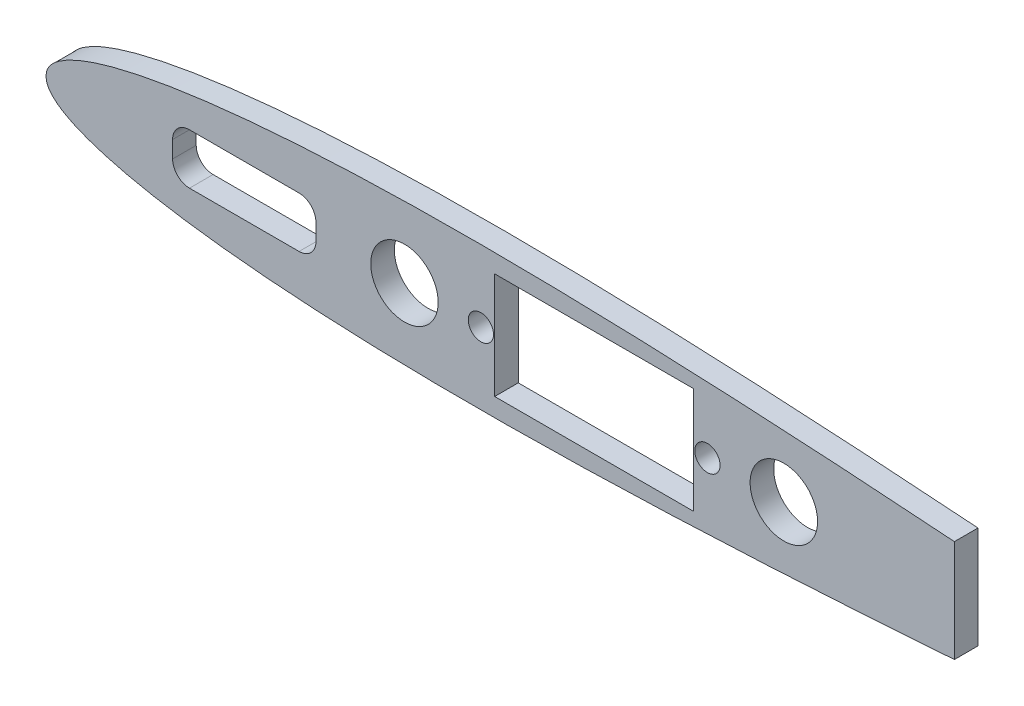
ISO-10303-21;
HEADER;
FILE_DESCRIPTION(('STEP AP214'),'2;1');
FILE_NAME('part.step','',(''),(''),'','','');
FILE_SCHEMA(('AUTOMOTIVE_DESIGN { 1 0 10303 214 1 1 1 1 }'));
ENDSEC;
DATA;
#1=APPLICATION_CONTEXT('core data for automotive mechanical design processes');
#2=APPLICATION_PROTOCOL_DEFINITION('international standard','automotive_design',2000,#1);
#3=PRODUCT_CONTEXT('',#1,'mechanical');
#4=PRODUCT('Part','Part','',(#3));
#5=PRODUCT_RELATED_PRODUCT_CATEGORY('part','',(#4));
#6=PRODUCT_DEFINITION_FORMATION('','',#4);
#7=PRODUCT_DEFINITION_CONTEXT('part definition',#1,'design');
#8=PRODUCT_DEFINITION('design','',#6,#7);
#9=PRODUCT_DEFINITION_SHAPE('','',#8);
#10=(LENGTH_UNIT() NAMED_UNIT(*) SI_UNIT(.MILLI.,.METRE.));
#11=(NAMED_UNIT(*) PLANE_ANGLE_UNIT() SI_UNIT($,.RADIAN.));
#12=(NAMED_UNIT(*) SI_UNIT($,.STERADIAN.) SOLID_ANGLE_UNIT());
#13=UNCERTAINTY_MEASURE_WITH_UNIT(LENGTH_MEASURE(1.E-05),#10,'distance_accuracy_value','');
#14=(GEOMETRIC_REPRESENTATION_CONTEXT(3) GLOBAL_UNCERTAINTY_ASSIGNED_CONTEXT((#13)) GLOBAL_UNIT_ASSIGNED_CONTEXT((#10,
#11,#12)) REPRESENTATION_CONTEXT('',''));
#15=CARTESIAN_POINT('',(0.,0.,0.));
#16=DIRECTION('',(0.,0.,1.));
#17=DIRECTION('',(1.,0.,0.));
#18=AXIS2_PLACEMENT_3D('',#15,#16,#17);
#19=CARTESIAN_POINT('',(217.74763411893,0.,1.4));
#20=DIRECTION('',(1.,0.,0.));
#21=DIRECTION('',(0.,0.,-1.));
#22=AXIS2_PLACEMENT_3D('',#19,#20,#21);
#23=PLANE('',#22);
#24=DIRECTION('',(0.,-1.,0.));
#25=VECTOR('',#24,1.);
#26=CARTESIAN_POINT('',(217.74763411893,0.,-1.4));
#27=LINE('',#26,#25);
#28=CARTESIAN_POINT('',(217.74763411893,6.05811307778919,-1.4));
#29=VERTEX_POINT('',#28);
#30=CARTESIAN_POINT('',(217.74763411893,-6.05811307778918,-1.4));
#31=VERTEX_POINT('',#30);
#32=EDGE_CURVE('E154',#29,#31,#27,.T.);
#33=ORIENTED_EDGE('',*,*,#32,.F.);
#34=DIRECTION('',(0.,0.,-1.));
#35=VECTOR('',#34,1.);
#36=CARTESIAN_POINT('',(217.74763411893,6.05811307778919,1.4));
#37=LINE('',#36,#35);
#38=CARTESIAN_POINT('',(217.74763411893,6.05811307778919,1.4));
#39=VERTEX_POINT('',#38);
#40=EDGE_CURVE('E11',#39,#29,#37,.T.);
#41=ORIENTED_EDGE('',*,*,#40,.F.);
#42=DIRECTION('',(0.,-1.,0.));
#43=VECTOR('',#42,1.);
#44=CARTESIAN_POINT('',(217.74763411893,0.,1.4));
#45=LINE('',#44,#43);
#46=CARTESIAN_POINT('',(217.74763411893,-6.05811307778918,1.4));
#47=VERTEX_POINT('',#46);
#48=EDGE_CURVE('E153',#39,#47,#45,.T.);
#49=ORIENTED_EDGE('',*,*,#48,.T.);
#50=DIRECTION('',(0.,0.,-1.));
#51=VECTOR('',#50,1.);
#52=CARTESIAN_POINT('',(217.74763411893,-6.05811307778918,1.4));
#53=LINE('',#52,#51);
#54=EDGE_CURVE('E111',#47,#31,#53,.T.);
#55=ORIENTED_EDGE('',*,*,#54,.T.);
#56=EDGE_LOOP('',(#33,#41,#49,#55));
#57=FACE_BOUND('',#56,.T.);
#58=ADVANCED_FACE('F36',(#57),#23,.T.);
#59=CARTESIAN_POINT('',(280.,0.1785,1.4));
#60=CARTESIAN_POINT('',(279.592043703671,0.226075897783467,1.4));
#61=CARTESIAN_POINT('',(278.452596210234,0.358958360844463,1.4));
#62=CARTESIAN_POINT('',(276.385426802208,0.596436481937331,1.4));
#63=CARTESIAN_POINT('',(273.651166983567,0.905304265461348,1.4));
#64=CARTESIAN_POINT('',(270.455833183168,1.25859090467058,1.4));
#65=CARTESIAN_POINT('',(266.898988861825,1.64260730411104,1.4));
#66=CARTESIAN_POINT('',(263.047743378214,2.04785660385741,1.4));
#67=CARTESIAN_POINT('',(258.952644661846,2.46718813772148,1.4));
#68=CARTESIAN_POINT('',(253.11611192075,3.04786904369115,1.4));
#69=CARTESIAN_POINT('',(247.071089235748,3.62220530992837,1.4));
#70=CARTESIAN_POINT('',(240.854179313273,4.18491264898859,1.4));
#71=CARTESIAN_POINT('',(236.038226964104,4.60581174883637,1.4));
#72=CARTESIAN_POINT('',(231.150377302514,5.0173511026198,1.4));
#73=CARTESIAN_POINT('',(226.209311113549,5.41695826474113,1.4));
#74=CARTESIAN_POINT('',(221.232257466585,5.802244474926,1.4));
#75=CARTESIAN_POINT('',(216.235178286272,6.17086457697306,1.4));
#76=CARTESIAN_POINT('',(211.232977593233,6.52047434958791,1.4));
#77=CARTESIAN_POINT('',(206.239642946259,6.84887299963153,1.4));
#78=CARTESIAN_POINT('',(201.268368916985,7.15382688632495,1.4));
#79=CARTESIAN_POINT('',(196.331634567492,7.43310533690328,1.4));
#80=CARTESIAN_POINT('',(191.441311474098,7.68460443906704,1.4));
#81=CARTESIAN_POINT('',(186.608700126931,7.90621829286941,1.4));
#82=CARTESIAN_POINT('',(181.844626933159,8.09595849303594,1.4));
#83=CARTESIAN_POINT('',(177.159453511195,8.25195768192942,1.4));
#84=CARTESIAN_POINT('',(172.563150271755,8.37248656398387,1.4));
#85=CARTESIAN_POINT('',(168.065295924147,8.45595366245417,1.4));
#86=CARTESIAN_POINT('',(163.675147454163,8.5010026998616,1.4));
#87=CARTESIAN_POINT('',(159.401643403725,8.50652296727326,1.4));
#88=CARTESIAN_POINT('',(155.253439755899,8.47152880790102,1.4));
#89=CARTESIAN_POINT('',(151.238917925322,8.39550607585732,1.4));
#90=CARTESIAN_POINT('',(147.366223919106,8.27798597685019,1.4));
#91=CARTESIAN_POINT('',(143.643266298458,8.11897556141504,1.4));
#92=CARTESIAN_POINT('',(140.077743555427,7.91867894287145,1.4));
#93=CARTESIAN_POINT('',(136.677139412155,7.67760454203032,1.4));
#94=CARTESIAN_POINT('',(133.44876289533,7.39648056861162,1.4));
#95=CARTESIAN_POINT('',(130.399721685833,7.07642431038863,1.4));
#96=CARTESIAN_POINT('',(127.536961088608,6.71865034112428,1.4));
#97=CARTESIAN_POINT('',(124.867245825052,6.32466607739586,1.4));
#98=CARTESIAN_POINT('',(122.397158973637,5.89612056643678,1.4));
#99=CARTESIAN_POINT('',(120.133109351335,5.43479747619412,1.4));
#100=CARTESIAN_POINT('',(118.081312132678,4.94256764101073,1.4));
#101=CARTESIAN_POINT('',(116.247665797811,4.42139238611828,1.4));
#102=CARTESIAN_POINT('',(114.637939719778,3.87306046577258,1.4));
#103=CARTESIAN_POINT('',(113.256788366372,3.29930923783808,1.4));
#104=CARTESIAN_POINT('',(112.109835923497,2.70130638754162,1.4));
#105=CARTESIAN_POINT('',(111.196336340545,2.07855523302877,1.4));
#106=CARTESIAN_POINT('',(110.530223641577,1.42706975809109,1.4));
#107=CARTESIAN_POINT('',(110.085538217979,0.734230220465984,1.4));
#108=CARTESIAN_POINT('',(110.027578175867,0.236721440142773,1.4));
#109=CARTESIAN_POINT('',(110.,0.,1.4));
#110=B_SPLINE_CURVE_WITH_KNOTS('',3,(#59,#60,#61,#62,#63,#64,#65,#66,#67,#68,#69,#70,#71,#72,
#73,#74,#75,#76,#77,#78,#79,#80,#81,#82,#83,#84,#85,#86,#87,#88,#89,#90,#91,#92,#93,#94,#95,#96,
#97,#98,#99,#100,#101,#102,#103,#104,#105,#106,#107,#108,#109),.UNSPECIFIED.,.F.,.F.,(4,1,1,1,1,
1,1,1,1,1,1,1,1,1,1,1,1,1,1,1,1,1,1,1,1,1,1,1,1,1,1,1,1,1,1,1,1,1,1,1,1,1,1,1,1,1,1,1,4),(0.,
0.00714472364101537,0.0199556607345446,0.0361960612227423,0.0550111837630616,0.0758789375062231,
0.0984288660950085,0.122375554002083,0.147487885417653,0.200459747132314,0.228005170188377,
0.256076453638138,0.284555151070125,0.31333276259982,0.342309553949656,0.371392651251454,
0.400495752426115,0.429537687145242,0.458441905920554,0.487136113386761,0.515551917136779,
0.543623846405843,0.571289984327897,0.598490809568145,0.625169613225281,0.651272029103837,
0.676746157949116,0.701541790883913,0.725611016556625,0.74890783507394,0.771387785068823,
0.793008138575143,0.813728032856974,0.833507815357633,0.852309696093785,0.870097310144046,
0.886835918069106,0.902492781713446,0.917037139140432,0.930441053860646,0.942679762162792,
0.953733567025024,0.963589785484808,0.97224701929817,0.979722225388436,0.986065145275041,
0.991385258303778,0.995900988803729,1.),.UNSPECIFIED.);
#111=DIRECTION('',(0.,0.,-1.));
#112=VECTOR('',#111,1.);
#113=SURFACE_OF_LINEAR_EXTRUSION('',#110,#112);
#114=CARTESIAN_POINT('',(280.,0.1785,-1.4));
#115=CARTESIAN_POINT('',(279.592043703671,0.226075897783467,-1.4));
#116=CARTESIAN_POINT('',(278.452596210234,0.358958360844463,-1.4));
#117=CARTESIAN_POINT('',(276.385426802208,0.596436481937331,-1.4));
#118=CARTESIAN_POINT('',(273.651166983567,0.905304265461348,-1.4));
#119=CARTESIAN_POINT('',(270.455833183168,1.25859090467058,-1.4));
#120=CARTESIAN_POINT('',(266.898988861825,1.64260730411104,-1.4));
#121=CARTESIAN_POINT('',(263.047743378214,2.04785660385741,-1.4));
#122=CARTESIAN_POINT('',(258.952644661846,2.46718813772148,-1.4));
#123=CARTESIAN_POINT('',(253.11611192075,3.04786904369115,-1.4));
#124=CARTESIAN_POINT('',(247.071089235748,3.62220530992837,-1.4));
#125=CARTESIAN_POINT('',(240.854179313273,4.18491264898859,-1.4));
#126=CARTESIAN_POINT('',(236.038226964104,4.60581174883637,-1.4));
#127=CARTESIAN_POINT('',(231.150377302514,5.0173511026198,-1.4));
#128=CARTESIAN_POINT('',(226.209311113549,5.41695826474113,-1.4));
#129=CARTESIAN_POINT('',(221.232257466585,5.802244474926,-1.4));
#130=CARTESIAN_POINT('',(216.235178286272,6.17086457697306,-1.4));
#131=CARTESIAN_POINT('',(211.232977593233,6.52047434958791,-1.4));
#132=CARTESIAN_POINT('',(206.239642946259,6.84887299963153,-1.4));
#133=CARTESIAN_POINT('',(201.268368916985,7.15382688632495,-1.4));
#134=CARTESIAN_POINT('',(196.331634567492,7.43310533690328,-1.4));
#135=CARTESIAN_POINT('',(191.441311474098,7.68460443906704,-1.4));
#136=CARTESIAN_POINT('',(186.608700126931,7.90621829286941,-1.4));
#137=CARTESIAN_POINT('',(181.844626933159,8.09595849303594,-1.4));
#138=CARTESIAN_POINT('',(177.159453511195,8.25195768192942,-1.4));
#139=CARTESIAN_POINT('',(172.563150271755,8.37248656398387,-1.4));
#140=CARTESIAN_POINT('',(168.065295924147,8.45595366245417,-1.4));
#141=CARTESIAN_POINT('',(163.675147454163,8.5010026998616,-1.4));
#142=CARTESIAN_POINT('',(159.401643403725,8.50652296727326,-1.4));
#143=CARTESIAN_POINT('',(155.253439755899,8.47152880790102,-1.4));
#144=CARTESIAN_POINT('',(151.238917925322,8.39550607585732,-1.4));
#145=CARTESIAN_POINT('',(147.366223919106,8.27798597685019,-1.4));
#146=CARTESIAN_POINT('',(143.643266298458,8.11897556141504,-1.4));
#147=CARTESIAN_POINT('',(140.077743555427,7.91867894287145,-1.4));
#148=CARTESIAN_POINT('',(136.677139412155,7.67760454203032,-1.4));
#149=CARTESIAN_POINT('',(133.44876289533,7.39648056861162,-1.4));
#150=CARTESIAN_POINT('',(130.399721685833,7.07642431038863,-1.4));
#151=CARTESIAN_POINT('',(127.536961088608,6.71865034112428,-1.4));
#152=CARTESIAN_POINT('',(124.867245825052,6.32466607739586,-1.4));
#153=CARTESIAN_POINT('',(122.397158973637,5.89612056643678,-1.4));
#154=CARTESIAN_POINT('',(120.133109351335,5.43479747619412,-1.4));
#155=CARTESIAN_POINT('',(118.081312132678,4.94256764101073,-1.4));
#156=CARTESIAN_POINT('',(116.247665797811,4.42139238611828,-1.4));
#157=CARTESIAN_POINT('',(114.637939719778,3.87306046577258,-1.4));
#158=CARTESIAN_POINT('',(113.256788366372,3.29930923783808,-1.4));
#159=CARTESIAN_POINT('',(112.109835923497,2.70130638754162,-1.4));
#160=CARTESIAN_POINT('',(111.196336340545,2.07855523302877,-1.4));
#161=CARTESIAN_POINT('',(110.530223641577,1.42706975809109,-1.4));
#162=CARTESIAN_POINT('',(110.085538217979,0.734230220465984,-1.4));
#163=CARTESIAN_POINT('',(110.027578175867,0.236721440142773,-1.4));
#164=CARTESIAN_POINT('',(110.,0.,-1.4));
#165=B_SPLINE_CURVE_WITH_KNOTS('',3,(#114,#115,#116,#117,#118,#119,#120,#121,#122,#123,#124,
#125,#126,#127,#128,#129,#130,#131,#132,#133,#134,#135,#136,#137,#138,#139,#140,#141,#142,#143,
#144,#145,#146,#147,#148,#149,#150,#151,#152,#153,#154,#155,#156,#157,#158,#159,#160,#161,#162,
#163,#164),.UNSPECIFIED.,.F.,.F.,(4,1,1,1,1,1,1,1,1,1,1,1,1,1,1,1,1,1,1,1,1,1,1,1,1,1,1,1,1,1,1,
1,1,1,1,1,1,1,1,1,1,1,1,1,1,1,1,1,4),(0.,0.00714472364101537,0.0199556607345446,
0.0361960612227423,0.0550111837630616,0.0758789375062231,0.0984288660950085,0.122375554002083,
0.147487885417653,0.200459747132314,0.228005170188377,0.256076453638138,0.284555151070125,
0.31333276259982,0.342309553949656,0.371392651251454,0.400495752426115,0.429537687145242,
0.458441905920554,0.487136113386761,0.515551917136779,0.543623846405843,0.571289984327897,
0.598490809568145,0.625169613225281,0.651272029103837,0.676746157949116,0.701541790883913,
0.725611016556625,0.74890783507394,0.771387785068823,0.793008138575143,0.813728032856974,
0.833507815357633,0.852309696093785,0.870097310144046,0.886835918069106,0.902492781713446,
0.917037139140432,0.930441053860646,0.942679762162792,0.953733567025024,0.963589785484808,
0.97224701929817,0.979722225388436,0.986065145275041,0.991385258303778,0.995900988803729,1.),.UNSPECIFIED.);
#166=CARTESIAN_POINT('',(110.,0.,-1.4));
#167=VERTEX_POINT('',#166);
#168=EDGE_CURVE('E299',#29,#167,#165,.T.);
#169=ORIENTED_EDGE('',*,*,#168,.T.);
#170=DIRECTION('',(0.,0.,-1.));
#171=VECTOR('',#170,1.);
#172=CARTESIAN_POINT('',(110.,0.,1.4));
#173=LINE('',#172,#171);
#174=CARTESIAN_POINT('',(110.,0.,1.4));
#175=VERTEX_POINT('',#174);
#176=EDGE_CURVE('E46',#175,#167,#173,.T.);
#177=ORIENTED_EDGE('',*,*,#176,.F.);
#178=EDGE_CURVE('E158',#39,#175,#110,.T.);
#179=ORIENTED_EDGE('',*,*,#178,.F.);
#180=ORIENTED_EDGE('',*,*,#40,.T.);
#181=EDGE_LOOP('',(#169,#177,#179,#180));
#182=FACE_BOUND('',#181,.T.);
#183=ADVANCED_FACE('F159',(#182),#113,.F.);
#184=CARTESIAN_POINT('',(0.,3.,1.4));
#185=DIRECTION('',(0.,1.,0.));
#186=DIRECTION('',(0.,0.,1.));
#187=AXIS2_PLACEMENT_3D('',#184,#185,#186);
#188=PLANE('',#187);
#189=DIRECTION('',(1.,0.,0.));
#190=VECTOR('',#189,1.);
#191=CARTESIAN_POINT('',(0.,3.,-1.4));
#192=LINE('',#191,#190);
#193=CARTESIAN_POINT('',(127.018484280221,3.,-1.4));
#194=VERTEX_POINT('',#193);
#195=CARTESIAN_POINT('',(140.018484280221,3.,-1.4));
#196=VERTEX_POINT('',#195);
#197=EDGE_CURVE('E277',#194,#196,#192,.T.);
#198=ORIENTED_EDGE('',*,*,#197,.T.);
#199=DIRECTION('',(0.,0.,-1.));
#200=VECTOR('',#199,1.);
#201=CARTESIAN_POINT('',(140.018484280221,3.,1.4));
#202=LINE('',#201,#200);
#203=CARTESIAN_POINT('',(140.018484280221,3.,1.4));
#204=VERTEX_POINT('',#203);
#205=EDGE_CURVE('E314',#204,#196,#202,.T.);
#206=ORIENTED_EDGE('',*,*,#205,.F.);
#207=DIRECTION('',(1.,0.,0.));
#208=VECTOR('',#207,1.);
#209=CARTESIAN_POINT('',(0.,3.,1.4));
#210=LINE('',#209,#208);
#211=CARTESIAN_POINT('',(127.018484280221,3.,1.4));
#212=VERTEX_POINT('',#211);
#213=EDGE_CURVE('E355',#212,#204,#210,.T.);
#214=ORIENTED_EDGE('',*,*,#213,.F.);
#215=DIRECTION('',(0.,0.,-1.));
#216=VECTOR('',#215,1.);
#217=CARTESIAN_POINT('',(127.018484280221,3.,1.4));
#218=LINE('',#217,#216);
#219=EDGE_CURVE('E316',#212,#194,#218,.T.);
#220=ORIENTED_EDGE('',*,*,#219,.T.);
#221=EDGE_LOOP('',(#198,#206,#214,#220));
#222=FACE_BOUND('',#221,.T.);
#223=ADVANCED_FACE('F182',(#222),#188,.F.);
#224=CARTESIAN_POINT('',(140.018484280221,1.,1.4));
#225=DIRECTION('',(0.,0.,-1.));
#226=DIRECTION('',(-1.,0.,0.));
#227=AXIS2_PLACEMENT_3D('',#224,#225,#226);
#228=CYLINDRICAL_SURFACE('',#227,2.);
#229=CARTESIAN_POINT('',(140.018484280221,1.,-1.4));
#230=DIRECTION('',(0.,0.,1.));
#231=DIRECTION('',(1.,0.,0.));
#232=AXIS2_PLACEMENT_3D('',#229,#230,#231);
#233=CIRCLE('',#232,2.);
#234=CARTESIAN_POINT('',(142.018484280221,0.999999999999986,-1.4));
#235=VERTEX_POINT('',#234);
#236=EDGE_CURVE('E280',#196,#235,#233,.F.);
#237=ORIENTED_EDGE('',*,*,#236,.T.);
#238=DIRECTION('',(0.,0.,-1.));
#239=VECTOR('',#238,1.);
#240=CARTESIAN_POINT('',(142.018484280221,0.999999999999986,1.4));
#241=LINE('',#240,#239);
#242=CARTESIAN_POINT('',(142.018484280221,0.999999999999986,1.4));
#243=VERTEX_POINT('',#242);
#244=EDGE_CURVE('E331',#243,#235,#241,.T.);
#245=ORIENTED_EDGE('',*,*,#244,.F.);
#246=CARTESIAN_POINT('',(140.018484280221,1.,1.4));
#247=DIRECTION('',(0.,0.,1.));
#248=DIRECTION('',(1.,0.,0.));
#249=AXIS2_PLACEMENT_3D('',#246,#247,#248);
#250=CIRCLE('',#249,2.);
#251=EDGE_CURVE('E365',#204,#243,#250,.F.);
#252=ORIENTED_EDGE('',*,*,#251,.F.);
#253=ORIENTED_EDGE('',*,*,#205,.T.);
#254=EDGE_LOOP('',(#237,#245,#252,#253));
#255=FACE_BOUND('',#254,.T.);
#256=ADVANCED_FACE('F213',(#255),#228,.F.);
#257=CARTESIAN_POINT('',(142.018484280221,0.,1.4));
#258=DIRECTION('',(-1.,0.,0.));
#259=DIRECTION('',(0.,0.,1.));
#260=AXIS2_PLACEMENT_3D('',#257,#258,#259);
#261=PLANE('',#260);
#262=DIRECTION('',(0.,1.,0.));
#263=VECTOR('',#262,1.);
#264=CARTESIAN_POINT('',(142.018484280221,0.,-1.4));
#265=LINE('',#264,#263);
#266=CARTESIAN_POINT('',(142.018484280221,-0.999999999999985,-1.4));
#267=VERTEX_POINT('',#266);
#268=EDGE_CURVE('E283',#267,#235,#265,.T.);
#269=ORIENTED_EDGE('',*,*,#268,.F.);
#270=DIRECTION('',(0.,0.,-1.));
#271=VECTOR('',#270,1.);
#272=CARTESIAN_POINT('',(142.018484280221,-0.999999999999985,1.4));
#273=LINE('',#272,#271);
#274=CARTESIAN_POINT('',(142.018484280221,-0.999999999999985,1.4));
#275=VERTEX_POINT('',#274);
#276=EDGE_CURVE('E329',#275,#267,#273,.T.);
#277=ORIENTED_EDGE('',*,*,#276,.F.);
#278=DIRECTION('',(0.,1.,0.));
#279=VECTOR('',#278,1.);
#280=CARTESIAN_POINT('',(142.018484280221,0.,1.4));
#281=LINE('',#280,#279);
#282=EDGE_CURVE('E367',#275,#243,#281,.T.);
#283=ORIENTED_EDGE('',*,*,#282,.T.);
#284=ORIENTED_EDGE('',*,*,#244,.T.);
#285=EDGE_LOOP('',(#269,#277,#283,#284));
#286=FACE_BOUND('',#285,.T.);
#287=ADVANCED_FACE('F209',(#286),#261,.T.);
#288=CARTESIAN_POINT('',(140.018484280221,-1.,1.4));
#289=DIRECTION('',(0.,0.,-1.));
#290=DIRECTION('',(-1.,0.,0.));
#291=AXIS2_PLACEMENT_3D('',#288,#289,#290);
#292=CYLINDRICAL_SURFACE('',#291,2.);
#293=CARTESIAN_POINT('',(140.018484280221,-1.,-1.4));
#294=DIRECTION('',(0.,0.,1.));
#295=DIRECTION('',(1.,0.,0.));
#296=AXIS2_PLACEMENT_3D('',#293,#294,#295);
#297=CIRCLE('',#296,2.);
#298=CARTESIAN_POINT('',(140.018484280221,-3.,-1.4));
#299=VERTEX_POINT('',#298);
#300=EDGE_CURVE('E286',#299,#267,#297,.T.);
#301=ORIENTED_EDGE('',*,*,#300,.F.);
#302=DIRECTION('',(0.,0.,-1.));
#303=VECTOR('',#302,1.);
#304=CARTESIAN_POINT('',(140.018484280221,-3.,1.4));
#305=LINE('',#304,#303);
#306=CARTESIAN_POINT('',(140.018484280221,-3.,1.4));
#307=VERTEX_POINT('',#306);
#308=EDGE_CURVE('E327',#307,#299,#305,.T.);
#309=ORIENTED_EDGE('',*,*,#308,.F.);
#310=CARTESIAN_POINT('',(140.018484280221,-1.,1.4));
#311=DIRECTION('',(0.,0.,1.));
#312=DIRECTION('',(1.,0.,0.));
#313=AXIS2_PLACEMENT_3D('',#310,#311,#312);
#314=CIRCLE('',#313,2.);
#315=EDGE_CURVE('E370',#307,#275,#314,.T.);
#316=ORIENTED_EDGE('',*,*,#315,.T.);
#317=ORIENTED_EDGE('',*,*,#276,.T.);
#318=EDGE_LOOP('',(#301,#309,#316,#317));
#319=FACE_BOUND('',#318,.T.);
#320=ADVANCED_FACE('F205',(#319),#292,.F.);
#321=CARTESIAN_POINT('',(0.,-3.,1.4));
#322=DIRECTION('',(0.,1.,0.));
#323=DIRECTION('',(0.,0.,1.));
#324=AXIS2_PLACEMENT_3D('',#321,#322,#323);
#325=PLANE('',#324);
#326=DIRECTION('',(1.,0.,0.));
#327=VECTOR('',#326,1.);
#328=CARTESIAN_POINT('',(0.,-3.,-1.4));
#329=LINE('',#328,#327);
#330=CARTESIAN_POINT('',(127.018484280221,-3.,-1.4));
#331=VERTEX_POINT('',#330);
#332=EDGE_CURVE('E289',#331,#299,#329,.T.);
#333=ORIENTED_EDGE('',*,*,#332,.F.);
#334=DIRECTION('',(0.,0.,-1.));
#335=VECTOR('',#334,1.);
#336=CARTESIAN_POINT('',(127.018484280221,-3.,1.4));
#337=LINE('',#336,#335);
#338=CARTESIAN_POINT('',(127.018484280221,-3.,1.4));
#339=VERTEX_POINT('',#338);
#340=EDGE_CURVE('E325',#339,#331,#337,.T.);
#341=ORIENTED_EDGE('',*,*,#340,.F.);
#342=DIRECTION('',(1.,0.,0.));
#343=VECTOR('',#342,1.);
#344=CARTESIAN_POINT('',(0.,-3.,1.4));
#345=LINE('',#344,#343);
#346=EDGE_CURVE('E373',#339,#307,#345,.T.);
#347=ORIENTED_EDGE('',*,*,#346,.T.);
#348=ORIENTED_EDGE('',*,*,#308,.T.);
#349=EDGE_LOOP('',(#333,#341,#347,#348));
#350=FACE_BOUND('',#349,.T.);
#351=ADVANCED_FACE('F201',(#350),#325,.T.);
#352=CARTESIAN_POINT('',(127.018484280221,-1.,1.4));
#353=DIRECTION('',(0.,0.,-1.));
#354=DIRECTION('',(-1.,0.,0.));
#355=AXIS2_PLACEMENT_3D('',#352,#353,#354);
#356=CYLINDRICAL_SURFACE('',#355,2.);
#357=CARTESIAN_POINT('',(127.018484280221,-1.,-1.4));
#358=DIRECTION('',(0.,0.,1.));
#359=DIRECTION('',(1.,0.,0.));
#360=AXIS2_PLACEMENT_3D('',#357,#358,#359);
#361=CIRCLE('',#360,2.);
#362=CARTESIAN_POINT('',(125.018484280221,-0.999999999999985,-1.4));
#363=VERTEX_POINT('',#362);
#364=EDGE_CURVE('E292',#331,#363,#361,.F.);
#365=ORIENTED_EDGE('',*,*,#364,.T.);
#366=DIRECTION('',(0.,0.,-1.));
#367=VECTOR('',#366,1.);
#368=CARTESIAN_POINT('',(125.018484280221,-0.999999999999985,1.4));
#369=LINE('',#368,#367);
#370=CARTESIAN_POINT('',(125.018484280221,-0.999999999999985,1.4));
#371=VERTEX_POINT('',#370);
#372=EDGE_CURVE('E322',#371,#363,#369,.T.);
#373=ORIENTED_EDGE('',*,*,#372,.F.);
#374=CARTESIAN_POINT('',(127.018484280221,-1.,1.4));
#375=DIRECTION('',(0.,0.,1.));
#376=DIRECTION('',(1.,0.,0.));
#377=AXIS2_PLACEMENT_3D('',#374,#375,#376);
#378=CIRCLE('',#377,2.);
#379=EDGE_CURVE('E376',#339,#371,#378,.F.);
#380=ORIENTED_EDGE('',*,*,#379,.F.);
#381=ORIENTED_EDGE('',*,*,#340,.T.);
#382=EDGE_LOOP('',(#365,#373,#380,#381));
#383=FACE_BOUND('',#382,.T.);
#384=ADVANCED_FACE('F197',(#383),#356,.F.);
#385=CARTESIAN_POINT('',(125.018484280221,0.,1.4));
#386=DIRECTION('',(-1.,0.,0.));
#387=DIRECTION('',(0.,0.,1.));
#388=AXIS2_PLACEMENT_3D('',#385,#386,#387);
#389=PLANE('',#388);
#390=DIRECTION('',(0.,1.,0.));
#391=VECTOR('',#390,1.);
#392=CARTESIAN_POINT('',(125.018484280221,0.,-1.4));
#393=LINE('',#392,#391);
#394=CARTESIAN_POINT('',(125.018484280221,0.999999999999986,-1.4));
#395=VERTEX_POINT('',#394);
#396=EDGE_CURVE('E294',#363,#395,#393,.T.);
#397=ORIENTED_EDGE('',*,*,#396,.T.);
#398=DIRECTION('',(0.,0.,-1.));
#399=VECTOR('',#398,1.);
#400=CARTESIAN_POINT('',(125.018484280221,0.999999999999986,1.4));
#401=LINE('',#400,#399);
#402=CARTESIAN_POINT('',(125.018484280221,0.999999999999986,1.4));
#403=VERTEX_POINT('',#402);
#404=EDGE_CURVE('E319',#403,#395,#401,.T.);
#405=ORIENTED_EDGE('',*,*,#404,.F.);
#406=DIRECTION('',(0.,1.,0.));
#407=VECTOR('',#406,1.);
#408=CARTESIAN_POINT('',(125.018484280221,0.,1.4));
#409=LINE('',#408,#407);
#410=EDGE_CURVE('E164',#371,#403,#409,.T.);
#411=ORIENTED_EDGE('',*,*,#410,.F.);
#412=ORIENTED_EDGE('',*,*,#372,.T.);
#413=EDGE_LOOP('',(#397,#405,#411,#412));
#414=FACE_BOUND('',#413,.T.);
#415=ADVANCED_FACE('F193',(#414),#389,.F.);
#416=CARTESIAN_POINT('',(186.818484280221,0.,1.4));
#417=DIRECTION('',(-1.,0.,0.));
#418=DIRECTION('',(0.,0.,1.));
#419=AXIS2_PLACEMENT_3D('',#416,#417,#418);
#420=PLANE('',#419);
#421=DIRECTION('',(0.,1.,0.));
#422=VECTOR('',#421,1.);
#423=CARTESIAN_POINT('',(186.818484280221,0.,-1.4));
#424=LINE('',#423,#422);
#425=CARTESIAN_POINT('',(186.818484280221,-6.3,-1.4));
#426=VERTEX_POINT('',#425);
#427=CARTESIAN_POINT('',(186.818484280221,6.3,-1.4));
#428=VERTEX_POINT('',#427);
#429=EDGE_CURVE('E265',#426,#428,#424,.T.);
#430=ORIENTED_EDGE('',*,*,#429,.F.);
#431=DIRECTION('',(0.,0.,-1.));
#432=VECTOR('',#431,1.);
#433=CARTESIAN_POINT('',(186.818484280221,-6.3,1.4));
#434=LINE('',#433,#432);
#435=CARTESIAN_POINT('',(186.818484280221,-6.3,1.4));
#436=VERTEX_POINT('',#435);
#437=EDGE_CURVE('E40',#436,#426,#434,.T.);
#438=ORIENTED_EDGE('',*,*,#437,.F.);
#439=DIRECTION('',(0.,1.,0.));
#440=VECTOR('',#439,1.);
#441=CARTESIAN_POINT('',(186.818484280221,0.,1.4));
#442=LINE('',#441,#440);
#443=CARTESIAN_POINT('',(186.818484280221,6.3,1.4));
#444=VERTEX_POINT('',#443);
#445=EDGE_CURVE('E359',#436,#444,#442,.T.);
#446=ORIENTED_EDGE('',*,*,#445,.T.);
#447=DIRECTION('',(0.,0.,-1.));
#448=VECTOR('',#447,1.);
#449=CARTESIAN_POINT('',(186.818484280221,6.3,1.4));
#450=LINE('',#449,#448);
#451=EDGE_CURVE('E335',#444,#428,#450,.T.);
#452=ORIENTED_EDGE('',*,*,#451,.T.);
#453=EDGE_LOOP('',(#430,#438,#446,#452));
#454=FACE_BOUND('',#453,.T.);
#455=ADVANCED_FACE('F196',(#454),#420,.T.);
#456=CARTESIAN_POINT('',(0.,-6.3,1.4));
#457=DIRECTION('',(0.,1.,0.));
#458=DIRECTION('',(0.,0.,1.));
#459=AXIS2_PLACEMENT_3D('',#456,#457,#458);
#460=PLANE('',#459);
#461=DIRECTION('',(1.,0.,0.));
#462=VECTOR('',#461,1.);
#463=CARTESIAN_POINT('',(0.,-6.3,-1.4));
#464=LINE('',#463,#462);
#465=CARTESIAN_POINT('',(163.218484280221,-6.3,-1.4));
#466=VERTEX_POINT('',#465);
#467=EDGE_CURVE('E268',#466,#426,#464,.T.);
#468=ORIENTED_EDGE('',*,*,#467,.F.);
#469=DIRECTION('',(0.,0.,-1.));
#470=VECTOR('',#469,1.);
#471=CARTESIAN_POINT('',(163.218484280221,-6.3,1.4));
#472=LINE('',#471,#470);
#473=CARTESIAN_POINT('',(163.218484280221,-6.3,1.4));
#474=VERTEX_POINT('',#473);
#475=EDGE_CURVE('E339',#474,#466,#472,.T.);
#476=ORIENTED_EDGE('',*,*,#475,.F.);
#477=DIRECTION('',(1.,0.,0.));
#478=VECTOR('',#477,1.);
#479=CARTESIAN_POINT('',(0.,-6.3,1.4));
#480=LINE('',#479,#478);
#481=EDGE_CURVE('E345',#474,#436,#480,.T.);
#482=ORIENTED_EDGE('',*,*,#481,.T.);
#483=ORIENTED_EDGE('',*,*,#437,.T.);
#484=EDGE_LOOP('',(#468,#476,#482,#483));
#485=FACE_BOUND('',#484,.T.);
#486=ADVANCED_FACE('F227',(#485),#460,.T.);
#487=CARTESIAN_POINT('',(163.218484280221,0.,1.4));
#488=DIRECTION('',(-1.,0.,0.));
#489=DIRECTION('',(0.,0.,1.));
#490=AXIS2_PLACEMENT_3D('',#487,#488,#489);
#491=PLANE('',#490);
#492=DIRECTION('',(0.,1.,0.));
#493=VECTOR('',#492,1.);
#494=CARTESIAN_POINT('',(163.218484280221,0.,-1.4));
#495=LINE('',#494,#493);
#496=CARTESIAN_POINT('',(163.218484280221,6.3,-1.4));
#497=VERTEX_POINT('',#496);
#498=EDGE_CURVE('E271',#466,#497,#495,.T.);
#499=ORIENTED_EDGE('',*,*,#498,.T.);
#500=DIRECTION('',(0.,0.,-1.));
#501=VECTOR('',#500,1.);
#502=CARTESIAN_POINT('',(163.218484280221,6.3,1.4));
#503=LINE('',#502,#501);
#504=CARTESIAN_POINT('',(163.218484280221,6.3,1.4));
#505=VERTEX_POINT('',#504);
#506=EDGE_CURVE('E337',#505,#497,#503,.T.);
#507=ORIENTED_EDGE('',*,*,#506,.F.);
#508=DIRECTION('',(0.,1.,0.));
#509=VECTOR('',#508,1.);
#510=CARTESIAN_POINT('',(163.218484280221,0.,1.4));
#511=LINE('',#510,#509);
#512=EDGE_CURVE('E352',#474,#505,#511,.T.);
#513=ORIENTED_EDGE('',*,*,#512,.F.);
#514=ORIENTED_EDGE('',*,*,#475,.T.);
#515=EDGE_LOOP('',(#499,#507,#513,#514));
#516=FACE_BOUND('',#515,.T.);
#517=ADVANCED_FACE('F191',(#516),#491,.F.);
#518=CARTESIAN_POINT('',(127.018484280221,1.,1.4));
#519=DIRECTION('',(0.,0.,-1.));
#520=DIRECTION('',(-1.,0.,0.));
#521=AXIS2_PLACEMENT_3D('',#518,#519,#520);
#522=CYLINDRICAL_SURFACE('',#521,2.);
#523=CARTESIAN_POINT('',(127.018484280221,1.,-1.4));
#524=DIRECTION('',(0.,0.,1.));
#525=DIRECTION('',(1.,0.,0.));
#526=AXIS2_PLACEMENT_3D('',#523,#524,#525);
#527=CIRCLE('',#526,2.);
#528=EDGE_CURVE('E296',#395,#194,#527,.F.);
#529=ORIENTED_EDGE('',*,*,#528,.T.);
#530=ORIENTED_EDGE('',*,*,#219,.F.);
#531=CARTESIAN_POINT('',(127.018484280221,1.,1.4));
#532=DIRECTION('',(0.,0.,1.));
#533=DIRECTION('',(1.,0.,0.));
#534=AXIS2_PLACEMENT_3D('',#531,#532,#533);
#535=CIRCLE('',#534,2.);
#536=EDGE_CURVE('E162',#403,#212,#535,.F.);
#537=ORIENTED_EDGE('',*,*,#536,.F.);
#538=ORIENTED_EDGE('',*,*,#404,.T.);
#539=EDGE_LOOP('',(#529,#530,#537,#538));
#540=FACE_BOUND('',#539,.T.);
#541=ADVANCED_FACE('F187',(#540),#522,.F.);
#542=CARTESIAN_POINT('',(0.,6.3,1.4));
#543=DIRECTION('',(0.,1.,0.));
#544=DIRECTION('',(0.,0.,1.));
#545=AXIS2_PLACEMENT_3D('',#542,#543,#544);
#546=PLANE('',#545);
#547=DIRECTION('',(1.,0.,0.));
#548=VECTOR('',#547,1.);
#549=CARTESIAN_POINT('',(0.,6.3,-1.4));
#550=LINE('',#549,#548);
#551=EDGE_CURVE('E274',#497,#428,#550,.T.);
#552=ORIENTED_EDGE('',*,*,#551,.T.);
#553=ORIENTED_EDGE('',*,*,#451,.F.);
#554=DIRECTION('',(1.,0.,0.));
#555=VECTOR('',#554,1.);
#556=CARTESIAN_POINT('',(0.,6.3,1.4));
#557=LINE('',#556,#555);
#558=EDGE_CURVE('E353',#505,#444,#557,.T.);
#559=ORIENTED_EDGE('',*,*,#558,.F.);
#560=ORIENTED_EDGE('',*,*,#506,.T.);
#561=EDGE_LOOP('',(#552,#553,#559,#560));
#562=FACE_BOUND('',#561,.T.);
#563=ADVANCED_FACE('F190',(#562),#546,.F.);
#564=CARTESIAN_POINT('',(152.518484280221,0.,1.4));
#565=DIRECTION('',(0.,0.,-1.));
#566=DIRECTION('',(-1.,0.,0.));
#567=AXIS2_PLACEMENT_3D('',#564,#565,#566);
#568=CYLINDRICAL_SURFACE('',#567,3.99999999999999);
#569=CARTESIAN_POINT('',(152.518484280221,0.,1.4));
#570=DIRECTION('',(0.,0.,1.));
#571=DIRECTION('',(1.,0.,0.));
#572=AXIS2_PLACEMENT_3D('',#569,#570,#571);
#573=CIRCLE('',#572,3.99999999999999);
#574=CARTESIAN_POINT('',(156.518484280221,0.,1.4));
#575=VERTEX_POINT('',#574);
#576=EDGE_CURVE('E425',#575,#575,#573,.T.);
#577=ORIENTED_EDGE('',*,*,#576,.T.);
#578=EDGE_LOOP('',(#577));
#579=FACE_BOUND('',#578,.T.);
#580=CARTESIAN_POINT('',(152.518484280221,0.,-1.4));
#581=DIRECTION('',(0.,0.,1.));
#582=DIRECTION('',(1.,0.,0.));
#583=AXIS2_PLACEMENT_3D('',#580,#581,#582);
#584=CIRCLE('',#583,3.99999999999999);
#585=CARTESIAN_POINT('',(156.518484280221,0.,-1.4));
#586=VERTEX_POINT('',#585);
#587=EDGE_CURVE('E259',#586,#586,#584,.T.);
#588=ORIENTED_EDGE('',*,*,#587,.F.);
#589=EDGE_LOOP('',(#588));
#590=FACE_BOUND('',#589,.T.);
#591=ADVANCED_FACE('F223',(#579,#590),#568,.F.);
#592=CARTESIAN_POINT('',(197.518484280221,0.,1.4));
#593=DIRECTION('',(0.,0.,-1.));
#594=DIRECTION('',(-1.,0.,0.));
#595=AXIS2_PLACEMENT_3D('',#592,#593,#594);
#596=CYLINDRICAL_SURFACE('',#595,3.99999999999999);
#597=CARTESIAN_POINT('',(197.518484280221,0.,1.4));
#598=DIRECTION('',(0.,0.,1.));
#599=DIRECTION('',(1.,0.,0.));
#600=AXIS2_PLACEMENT_3D('',#597,#598,#599);
#601=CIRCLE('',#600,3.99999999999999);
#602=CARTESIAN_POINT('',(201.518484280221,0.,1.4));
#603=VERTEX_POINT('',#602);
#604=EDGE_CURVE('E422',#603,#603,#601,.T.);
#605=ORIENTED_EDGE('',*,*,#604,.T.);
#606=EDGE_LOOP('',(#605));
#607=FACE_BOUND('',#606,.T.);
#608=CARTESIAN_POINT('',(197.518484280221,0.,-1.4));
#609=DIRECTION('',(0.,0.,1.));
#610=DIRECTION('',(1.,0.,0.));
#611=AXIS2_PLACEMENT_3D('',#608,#609,#610);
#612=CIRCLE('',#611,3.99999999999999);
#613=CARTESIAN_POINT('',(201.518484280221,0.,-1.4));
#614=VERTEX_POINT('',#613);
#615=EDGE_CURVE('E255',#614,#614,#612,.T.);
#616=ORIENTED_EDGE('',*,*,#615,.F.);
#617=EDGE_LOOP('',(#616));
#618=FACE_BOUND('',#617,.T.);
#619=ADVANCED_FACE('F236',(#607,#618),#596,.F.);
#620=CARTESIAN_POINT('',(188.453484280221,0.,1.4));
#621=DIRECTION('',(0.,0.,-1.));
#622=DIRECTION('',(-1.,0.,0.));
#623=AXIS2_PLACEMENT_3D('',#620,#621,#622);
#624=CYLINDRICAL_SURFACE('',#623,1.5);
#625=CARTESIAN_POINT('',(188.453484280221,0.,1.4));
#626=DIRECTION('',(0.,0.,1.));
#627=DIRECTION('',(1.,0.,0.));
#628=AXIS2_PLACEMENT_3D('',#625,#626,#627);
#629=CIRCLE('',#628,1.5);
#630=CARTESIAN_POINT('',(189.953484280221,0.,1.4));
#631=VERTEX_POINT('',#630);
#632=EDGE_CURVE('E250',#631,#631,#629,.T.);
#633=ORIENTED_EDGE('',*,*,#632,.T.);
#634=EDGE_LOOP('',(#633));
#635=FACE_BOUND('',#634,.T.);
#636=CARTESIAN_POINT('',(188.453484280221,0.,-1.4));
#637=DIRECTION('',(0.,0.,1.));
#638=DIRECTION('',(1.,0.,0.));
#639=AXIS2_PLACEMENT_3D('',#636,#637,#638);
#640=CIRCLE('',#639,1.5);
#641=CARTESIAN_POINT('',(189.953484280221,0.,-1.4));
#642=VERTEX_POINT('',#641);
#643=EDGE_CURVE('E253',#642,#642,#640,.T.);
#644=ORIENTED_EDGE('',*,*,#643,.F.);
#645=EDGE_LOOP('',(#644));
#646=FACE_BOUND('',#645,.T.);
#647=ADVANCED_FACE('F239',(#635,#646),#624,.F.);
#648=CARTESIAN_POINT('',(161.583484280221,0.,1.4));
#649=DIRECTION('',(0.,0.,-1.));
#650=DIRECTION('',(-1.,0.,0.));
#651=AXIS2_PLACEMENT_3D('',#648,#649,#650);
#652=CYLINDRICAL_SURFACE('',#651,1.5);
#653=CARTESIAN_POINT('',(161.583484280221,0.,1.4));
#654=DIRECTION('',(0.,0.,1.));
#655=DIRECTION('',(1.,0.,0.));
#656=AXIS2_PLACEMENT_3D('',#653,#654,#655);
#657=CIRCLE('',#656,1.5);
#658=CARTESIAN_POINT('',(163.083484280221,0.,1.4));
#659=VERTEX_POINT('',#658);
#660=EDGE_CURVE('E309',#659,#659,#657,.F.);
#661=ORIENTED_EDGE('',*,*,#660,.F.);
#662=EDGE_LOOP('',(#661));
#663=FACE_BOUND('',#662,.T.);
#664=CARTESIAN_POINT('',(161.583484280221,0.,-1.4));
#665=DIRECTION('',(0.,0.,1.));
#666=DIRECTION('',(1.,0.,0.));
#667=AXIS2_PLACEMENT_3D('',#664,#665,#666);
#668=CIRCLE('',#667,1.5);
#669=CARTESIAN_POINT('',(163.083484280221,0.,-1.4));
#670=VERTEX_POINT('',#669);
#671=EDGE_CURVE('E256',#670,#670,#668,.F.);
#672=ORIENTED_EDGE('',*,*,#671,.T.);
#673=EDGE_LOOP('',(#672));
#674=FACE_BOUND('',#673,.T.);
#675=ADVANCED_FACE('F38',(#663,#674),#652,.F.);
#676=CARTESIAN_POINT('',(110.,0.,1.4));
#677=CARTESIAN_POINT('',(110.027578175867,-0.236721440142772,1.4));
#678=CARTESIAN_POINT('',(110.085538217979,-0.734230220465975,1.4));
#679=CARTESIAN_POINT('',(110.530223641577,-1.42706975809109,1.4));
#680=CARTESIAN_POINT('',(111.196336340545,-2.07855523302878,1.4));
#681=CARTESIAN_POINT('',(112.109835923497,-2.70130638754161,1.4));
#682=CARTESIAN_POINT('',(113.256788366372,-3.29930923783809,1.4));
#683=CARTESIAN_POINT('',(114.637939719778,-3.87306046577258,1.4));
#684=CARTESIAN_POINT('',(116.24766579781,-4.42139238611828,1.4));
#685=CARTESIAN_POINT('',(118.081312132678,-4.94256764101073,1.4));
#686=CARTESIAN_POINT('',(120.133109351335,-5.43479747619412,1.4));
#687=CARTESIAN_POINT('',(122.397158973637,-5.89612056643677,1.4));
#688=CARTESIAN_POINT('',(124.867245825052,-6.32466607739586,1.4));
#689=CARTESIAN_POINT('',(127.536961088608,-6.71865034112428,1.4));
#690=CARTESIAN_POINT('',(130.399721685833,-7.07642431038863,1.4));
#691=CARTESIAN_POINT('',(133.44876289533,-7.39648056861162,1.4));
#692=CARTESIAN_POINT('',(136.677139412155,-7.67760454203032,1.4));
#693=CARTESIAN_POINT('',(140.077743555427,-7.91867894287145,1.4));
#694=CARTESIAN_POINT('',(143.643266298458,-8.11897556141504,1.4));
#695=CARTESIAN_POINT('',(147.366223919106,-8.27798597685019,1.4));
#696=CARTESIAN_POINT('',(151.238917925322,-8.39550607585732,1.4));
#697=CARTESIAN_POINT('',(155.253439755899,-8.47152880790102,1.4));
#698=CARTESIAN_POINT('',(159.401643403725,-8.50652296727325,1.4));
#699=CARTESIAN_POINT('',(163.675147454163,-8.5010026998616,1.4));
#700=CARTESIAN_POINT('',(168.065295924147,-8.45595366245417,1.4));
#701=CARTESIAN_POINT('',(172.563150271755,-8.37248656398386,1.4));
#702=CARTESIAN_POINT('',(177.159453511195,-8.25195768192942,1.4));
#703=CARTESIAN_POINT('',(181.844626933159,-8.09595849303594,1.4));
#704=CARTESIAN_POINT('',(186.60870012693,-7.90621829286941,1.4));
#705=CARTESIAN_POINT('',(191.441311474098,-7.68460443906704,1.4));
#706=CARTESIAN_POINT('',(196.331634567492,-7.43310533690328,1.4));
#707=CARTESIAN_POINT('',(201.268368916985,-7.15382688632495,1.4));
#708=CARTESIAN_POINT('',(206.239642946259,-6.84887299963153,1.4));
#709=CARTESIAN_POINT('',(211.232977593233,-6.52047434958792,1.4));
#710=CARTESIAN_POINT('',(216.235178286271,-6.17086457697306,1.4));
#711=CARTESIAN_POINT('',(221.232257466585,-5.802244474926,1.4));
#712=CARTESIAN_POINT('',(226.209311113548,-5.41695826474113,1.4));
#713=CARTESIAN_POINT('',(231.150377302515,-5.0173511026198,1.4));
#714=CARTESIAN_POINT('',(236.038226964104,-4.60581174883637,1.4));
#715=CARTESIAN_POINT('',(240.854179313273,-4.18491264898859,1.4));
#716=CARTESIAN_POINT('',(247.071089235748,-3.62220530992837,1.4));
#717=CARTESIAN_POINT('',(253.11611192075,-3.04786904369115,1.4));
#718=CARTESIAN_POINT('',(258.952644661846,-2.46718813772147,1.4));
#719=CARTESIAN_POINT('',(263.047743378214,-2.04785660385741,1.4));
#720=CARTESIAN_POINT('',(266.898988861825,-1.64260730411104,1.4));
#721=CARTESIAN_POINT('',(270.455833183168,-1.25859090467058,1.4));
#722=CARTESIAN_POINT('',(273.651166983567,-0.905304265461349,1.4));
#723=CARTESIAN_POINT('',(276.385426802208,-0.59643648193733,1.4));
#724=CARTESIAN_POINT('',(278.452596210234,-0.358958360844466,1.4));
#725=CARTESIAN_POINT('',(279.592043703671,-0.226075897783468,1.4));
#726=CARTESIAN_POINT('',(280.,-0.1785,1.4));
#727=B_SPLINE_CURVE_WITH_KNOTS('',3,(#676,#677,#678,#679,#680,#681,#682,#683,#684,#685,#686,
#687,#688,#689,#690,#691,#692,#693,#694,#695,#696,#697,#698,#699,#700,#701,#702,#703,#704,#705,
#706,#707,#708,#709,#710,#711,#712,#713,#714,#715,#716,#717,#718,#719,#720,#721,#722,#723,#724,
#725,#726),.UNSPECIFIED.,.F.,.F.,(4,1,1,1,1,1,1,1,1,1,1,1,1,1,1,1,1,1,1,1,1,1,1,1,1,1,1,1,1,1,1,
1,1,1,1,1,1,1,1,1,1,1,1,1,1,1,1,1,4),(0.,0.00409901119627066,0.00861474169622249,
0.013934854724959,0.0202777746115639,0.0277529807018305,0.0364102145151919,0.0462664329749759,
0.057320237837208,0.0695589461393541,0.0829628608595683,0.0975072182865541,0.113164081930894,
0.129902689855954,0.147690303906216,0.166492184642367,0.186271967143026,0.206991861424858,
0.228612214931177,0.25109216492606,0.274388983443375,0.298458209116087,0.323253842050884,
0.348727970896163,0.374830386774719,0.401509190431855,0.428710015672103,0.456376153594157,
0.484448082863221,0.512863886613239,0.541558094079446,0.570462312854758,0.599504247573885,
0.628607348748546,0.657690446050344,0.68666723740018,0.715444848929875,0.743923546361862,
0.771994829811623,0.799540252867686,0.852512114582347,0.877624445997917,0.901571133904992,
0.924121062493777,0.944988816236938,0.963803938777258,0.980044339265455,0.992855276358985,1.),.UNSPECIFIED.);
#728=DIRECTION('',(0.,0.,-1.));
#729=VECTOR('',#728,1.);
#730=SURFACE_OF_LINEAR_EXTRUSION('',#727,#729);
#731=CARTESIAN_POINT('',(110.,0.,-1.4));
#732=CARTESIAN_POINT('',(110.027578175867,-0.236721440142772,-1.4));
#733=CARTESIAN_POINT('',(110.085538217979,-0.734230220465975,-1.4));
#734=CARTESIAN_POINT('',(110.530223641577,-1.42706975809109,-1.4));
#735=CARTESIAN_POINT('',(111.196336340545,-2.07855523302878,-1.4));
#736=CARTESIAN_POINT('',(112.109835923497,-2.70130638754161,-1.4));
#737=CARTESIAN_POINT('',(113.256788366372,-3.29930923783809,-1.4));
#738=CARTESIAN_POINT('',(114.637939719778,-3.87306046577258,-1.4));
#739=CARTESIAN_POINT('',(116.24766579781,-4.42139238611828,-1.4));
#740=CARTESIAN_POINT('',(118.081312132678,-4.94256764101073,-1.4));
#741=CARTESIAN_POINT('',(120.133109351335,-5.43479747619412,-1.4));
#742=CARTESIAN_POINT('',(122.397158973637,-5.89612056643677,-1.4));
#743=CARTESIAN_POINT('',(124.867245825052,-6.32466607739586,-1.4));
#744=CARTESIAN_POINT('',(127.536961088608,-6.71865034112428,-1.4));
#745=CARTESIAN_POINT('',(130.399721685833,-7.07642431038863,-1.4));
#746=CARTESIAN_POINT('',(133.44876289533,-7.39648056861162,-1.4));
#747=CARTESIAN_POINT('',(136.677139412155,-7.67760454203032,-1.4));
#748=CARTESIAN_POINT('',(140.077743555427,-7.91867894287145,-1.4));
#749=CARTESIAN_POINT('',(143.643266298458,-8.11897556141504,-1.4));
#750=CARTESIAN_POINT('',(147.366223919106,-8.27798597685019,-1.4));
#751=CARTESIAN_POINT('',(151.238917925322,-8.39550607585732,-1.4));
#752=CARTESIAN_POINT('',(155.253439755899,-8.47152880790102,-1.4));
#753=CARTESIAN_POINT('',(159.401643403725,-8.50652296727325,-1.4));
#754=CARTESIAN_POINT('',(163.675147454163,-8.5010026998616,-1.4));
#755=CARTESIAN_POINT('',(168.065295924147,-8.45595366245417,-1.4));
#756=CARTESIAN_POINT('',(172.563150271755,-8.37248656398386,-1.4));
#757=CARTESIAN_POINT('',(177.159453511195,-8.25195768192942,-1.4));
#758=CARTESIAN_POINT('',(181.844626933159,-8.09595849303594,-1.4));
#759=CARTESIAN_POINT('',(186.60870012693,-7.90621829286941,-1.4));
#760=CARTESIAN_POINT('',(191.441311474098,-7.68460443906704,-1.4));
#761=CARTESIAN_POINT('',(196.331634567492,-7.43310533690328,-1.4));
#762=CARTESIAN_POINT('',(201.268368916985,-7.15382688632495,-1.4));
#763=CARTESIAN_POINT('',(206.239642946259,-6.84887299963153,-1.4));
#764=CARTESIAN_POINT('',(211.232977593233,-6.52047434958792,-1.4));
#765=CARTESIAN_POINT('',(216.235178286271,-6.17086457697306,-1.4));
#766=CARTESIAN_POINT('',(221.232257466585,-5.802244474926,-1.4));
#767=CARTESIAN_POINT('',(226.209311113548,-5.41695826474113,-1.4));
#768=CARTESIAN_POINT('',(231.150377302515,-5.0173511026198,-1.4));
#769=CARTESIAN_POINT('',(236.038226964104,-4.60581174883637,-1.4));
#770=CARTESIAN_POINT('',(240.854179313273,-4.18491264898859,-1.4));
#771=CARTESIAN_POINT('',(247.071089235748,-3.62220530992837,-1.4));
#772=CARTESIAN_POINT('',(253.11611192075,-3.04786904369115,-1.4));
#773=CARTESIAN_POINT('',(258.952644661846,-2.46718813772147,-1.4));
#774=CARTESIAN_POINT('',(263.047743378214,-2.04785660385741,-1.4));
#775=CARTESIAN_POINT('',(266.898988861825,-1.64260730411104,-1.4));
#776=CARTESIAN_POINT('',(270.455833183168,-1.25859090467058,-1.4));
#777=CARTESIAN_POINT('',(273.651166983567,-0.905304265461349,-1.4));
#778=CARTESIAN_POINT('',(276.385426802208,-0.59643648193733,-1.4));
#779=CARTESIAN_POINT('',(278.452596210234,-0.358958360844466,-1.4));
#780=CARTESIAN_POINT('',(279.592043703671,-0.226075897783468,-1.4));
#781=CARTESIAN_POINT('',(280.,-0.1785,-1.4));
#782=B_SPLINE_CURVE_WITH_KNOTS('',3,(#731,#732,#733,#734,#735,#736,#737,#738,#739,#740,#741,
#742,#743,#744,#745,#746,#747,#748,#749,#750,#751,#752,#753,#754,#755,#756,#757,#758,#759,#760,
#761,#762,#763,#764,#765,#766,#767,#768,#769,#770,#771,#772,#773,#774,#775,#776,#777,#778,#779,
#780,#781),.UNSPECIFIED.,.F.,.F.,(4,1,1,1,1,1,1,1,1,1,1,1,1,1,1,1,1,1,1,1,1,1,1,1,1,1,1,1,1,1,1,
1,1,1,1,1,1,1,1,1,1,1,1,1,1,1,1,1,4),(0.,0.00409901119627066,0.00861474169622249,
0.013934854724959,0.0202777746115639,0.0277529807018305,0.0364102145151919,0.0462664329749759,
0.057320237837208,0.0695589461393541,0.0829628608595683,0.0975072182865541,0.113164081930894,
0.129902689855954,0.147690303906216,0.166492184642367,0.186271967143026,0.206991861424858,
0.228612214931177,0.25109216492606,0.274388983443375,0.298458209116087,0.323253842050884,
0.348727970896163,0.374830386774719,0.401509190431855,0.428710015672103,0.456376153594157,
0.484448082863221,0.512863886613239,0.541558094079446,0.570462312854758,0.599504247573885,
0.628607348748546,0.657690446050344,0.68666723740018,0.715444848929875,0.743923546361862,
0.771994829811623,0.799540252867686,0.852512114582347,0.877624445997917,0.901571133904992,
0.924121062493777,0.944988816236938,0.963803938777258,0.980044339265455,0.992855276358985,1.),.UNSPECIFIED.);
#783=EDGE_CURVE('E104',#167,#31,#782,.T.);
#784=ORIENTED_EDGE('',*,*,#783,.T.);
#785=ORIENTED_EDGE('',*,*,#54,.F.);
#786=EDGE_CURVE('E55',#175,#47,#727,.T.);
#787=ORIENTED_EDGE('',*,*,#786,.F.);
#788=ORIENTED_EDGE('',*,*,#176,.T.);
#789=EDGE_LOOP('',(#784,#785,#787,#788));
#790=FACE_BOUND('',#789,.T.);
#791=ADVANCED_FACE('F183',(#790),#730,.F.);
#792=CARTESIAN_POINT('',(0.,0.,1.4));
#793=DIRECTION('',(0.,0.,1.));
#794=DIRECTION('',(1.,0.,0.));
#795=AXIS2_PLACEMENT_3D('',#792,#793,#794);
#796=PLANE('',#795);
#797=ORIENTED_EDGE('',*,*,#660,.T.);
#798=EDGE_LOOP('',(#797));
#799=FACE_BOUND('',#798,.T.);
#800=ORIENTED_EDGE('',*,*,#632,.F.);
#801=EDGE_LOOP('',(#800));
#802=FACE_BOUND('',#801,.T.);
#803=ORIENTED_EDGE('',*,*,#604,.F.);
#804=EDGE_LOOP('',(#803));
#805=FACE_BOUND('',#804,.T.);
#806=ORIENTED_EDGE('',*,*,#576,.F.);
#807=EDGE_LOOP('',(#806));
#808=FACE_BOUND('',#807,.T.);
#809=ORIENTED_EDGE('',*,*,#445,.F.);
#810=ORIENTED_EDGE('',*,*,#481,.F.);
#811=ORIENTED_EDGE('',*,*,#512,.T.);
#812=ORIENTED_EDGE('',*,*,#558,.T.);
#813=EDGE_LOOP('',(#809,#810,#811,#812));
#814=FACE_BOUND('',#813,.T.);
#815=ORIENTED_EDGE('',*,*,#213,.T.);
#816=ORIENTED_EDGE('',*,*,#251,.T.);
#817=ORIENTED_EDGE('',*,*,#282,.F.);
#818=ORIENTED_EDGE('',*,*,#315,.F.);
#819=ORIENTED_EDGE('',*,*,#346,.F.);
#820=ORIENTED_EDGE('',*,*,#379,.T.);
#821=ORIENTED_EDGE('',*,*,#410,.T.);
#822=ORIENTED_EDGE('',*,*,#536,.T.);
#823=EDGE_LOOP('',(#815,#816,#817,#818,#819,#820,#821,#822));
#824=FACE_BOUND('',#823,.T.);
#825=ORIENTED_EDGE('',*,*,#48,.F.);
#826=ORIENTED_EDGE('',*,*,#178,.T.);
#827=ORIENTED_EDGE('',*,*,#786,.T.);
#828=EDGE_LOOP('',(#825,#826,#827));
#829=FACE_BOUND('',#828,.T.);
#830=ADVANCED_FACE('F161',(#799,#802,#805,#808,#814,#824,#829),#796,.T.);
#831=CARTESIAN_POINT('',(0.,0.,-1.4));
#832=DIRECTION('',(0.,0.,1.));
#833=DIRECTION('',(1.,0.,0.));
#834=AXIS2_PLACEMENT_3D('',#831,#832,#833);
#835=PLANE('',#834);
#836=ORIENTED_EDGE('',*,*,#671,.F.);
#837=EDGE_LOOP('',(#836));
#838=FACE_BOUND('',#837,.T.);
#839=ORIENTED_EDGE('',*,*,#643,.T.);
#840=EDGE_LOOP('',(#839));
#841=FACE_BOUND('',#840,.T.);
#842=ORIENTED_EDGE('',*,*,#615,.T.);
#843=EDGE_LOOP('',(#842));
#844=FACE_BOUND('',#843,.T.);
#845=ORIENTED_EDGE('',*,*,#587,.T.);
#846=EDGE_LOOP('',(#845));
#847=FACE_BOUND('',#846,.T.);
#848=ORIENTED_EDGE('',*,*,#429,.T.);
#849=ORIENTED_EDGE('',*,*,#551,.F.);
#850=ORIENTED_EDGE('',*,*,#498,.F.);
#851=ORIENTED_EDGE('',*,*,#467,.T.);
#852=EDGE_LOOP('',(#848,#849,#850,#851));
#853=FACE_BOUND('',#852,.T.);
#854=ORIENTED_EDGE('',*,*,#197,.F.);
#855=ORIENTED_EDGE('',*,*,#528,.F.);
#856=ORIENTED_EDGE('',*,*,#396,.F.);
#857=ORIENTED_EDGE('',*,*,#364,.F.);
#858=ORIENTED_EDGE('',*,*,#332,.T.);
#859=ORIENTED_EDGE('',*,*,#300,.T.);
#860=ORIENTED_EDGE('',*,*,#268,.T.);
#861=ORIENTED_EDGE('',*,*,#236,.F.);
#862=EDGE_LOOP('',(#854,#855,#856,#857,#858,#859,#860,#861));
#863=FACE_BOUND('',#862,.T.);
#864=ORIENTED_EDGE('',*,*,#32,.T.);
#865=ORIENTED_EDGE('',*,*,#783,.F.);
#866=ORIENTED_EDGE('',*,*,#168,.F.);
#867=EDGE_LOOP('',(#864,#865,#866));
#868=FACE_BOUND('',#867,.T.);
#869=ADVANCED_FACE('F348',(#838,#841,#844,#847,#853,#863,#868),#835,.F.);
#870=CLOSED_SHELL('',(#58,#183,#223,#256,#287,#320,#351,#384,#415,#455,#486,#517,#541,#563,#591,
#619,#647,#675,#791,#830,#869));
#871=MANIFOLD_SOLID_BREP('B2',#870);
#872=ADVANCED_BREP_SHAPE_REPRESENTATION('',(#18,#871),#14);
#873=SHAPE_DEFINITION_REPRESENTATION(#9,#872);
ENDSEC;
END-ISO-10303-21;
